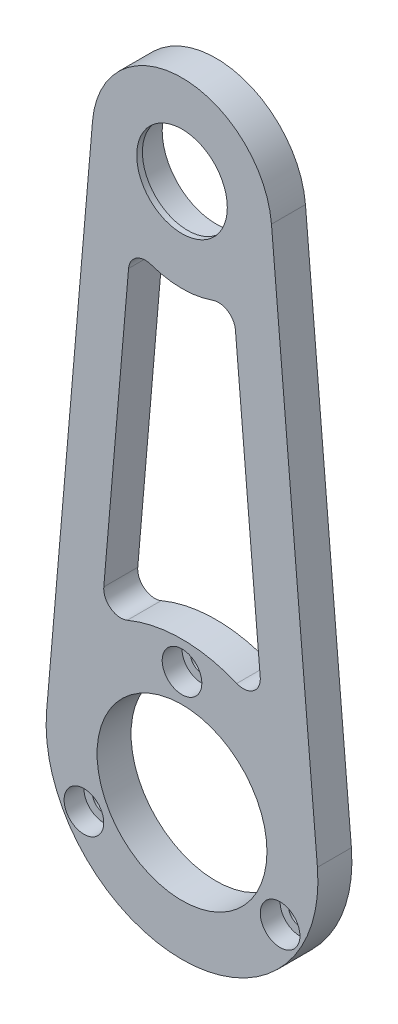
ISO-10303-21;
HEADER;
FILE_DESCRIPTION(('STEP AP214'),'2;1');
FILE_NAME('part.step','',(''),(''),'','','');
FILE_SCHEMA(('AUTOMOTIVE_DESIGN { 1 0 10303 214 1 1 1 1 }'));
ENDSEC;
DATA;
#1=APPLICATION_CONTEXT('core data for automotive mechanical design processes');
#2=APPLICATION_PROTOCOL_DEFINITION('international standard','automotive_design',2000,#1);
#3=PRODUCT_CONTEXT('',#1,'mechanical');
#4=PRODUCT('Part','Part','',(#3));
#5=PRODUCT_RELATED_PRODUCT_CATEGORY('part','',(#4));
#6=PRODUCT_DEFINITION_FORMATION('','',#4);
#7=PRODUCT_DEFINITION_CONTEXT('part definition',#1,'design');
#8=PRODUCT_DEFINITION('design','',#6,#7);
#9=PRODUCT_DEFINITION_SHAPE('','',#8);
#10=(LENGTH_UNIT() NAMED_UNIT(*) SI_UNIT(.MILLI.,.METRE.));
#11=(NAMED_UNIT(*) PLANE_ANGLE_UNIT() SI_UNIT($,.RADIAN.));
#12=(NAMED_UNIT(*) SI_UNIT($,.STERADIAN.) SOLID_ANGLE_UNIT());
#13=UNCERTAINTY_MEASURE_WITH_UNIT(LENGTH_MEASURE(1.E-05),#10,'distance_accuracy_value','');
#14=(GEOMETRIC_REPRESENTATION_CONTEXT(3) GLOBAL_UNCERTAINTY_ASSIGNED_CONTEXT((#13)) GLOBAL_UNIT_ASSIGNED_CONTEXT((#10,
#11,#12)) REPRESENTATION_CONTEXT('',''));
#15=CARTESIAN_POINT('',(0.,0.,0.));
#16=DIRECTION('',(0.,0.,1.));
#17=DIRECTION('',(1.,0.,0.));
#18=AXIS2_PLACEMENT_3D('',#15,#16,#17);
#19=CARTESIAN_POINT('',(0.,95.,6.));
#20=DIRECTION('',(0.,0.,-1.));
#21=DIRECTION('',(-1.,0.,0.));
#22=AXIS2_PLACEMENT_3D('',#19,#20,#21);
#23=CYLINDRICAL_SURFACE('',#22,9.5);
#24=CARTESIAN_POINT('',(0.,95.,0.));
#25=DIRECTION('',(0.,0.,-1.));
#26=DIRECTION('',(-1.,0.,0.));
#27=AXIS2_PLACEMENT_3D('',#24,#25,#26);
#28=CIRCLE('',#27,9.5);
#29=CARTESIAN_POINT('',(-9.5,95.,0.));
#30=VERTEX_POINT('',#29);
#31=EDGE_CURVE('E201',#30,#30,#28,.T.);
#32=ORIENTED_EDGE('',*,*,#31,.T.);
#33=EDGE_LOOP('',(#32));
#34=FACE_BOUND('',#33,.T.);
#35=CARTESIAN_POINT('',(0.,95.,5.));
#36=DIRECTION('',(0.,0.,1.));
#37=DIRECTION('',(1.,0.,0.));
#38=AXIS2_PLACEMENT_3D('',#35,#36,#37);
#39=CIRCLE('',#38,9.5);
#40=CARTESIAN_POINT('',(9.5,95.,5.));
#41=VERTEX_POINT('',#40);
#42=EDGE_CURVE('E11',#41,#41,#39,.F.);
#43=ORIENTED_EDGE('',*,*,#42,.F.);
#44=EDGE_LOOP('',(#43));
#45=FACE_BOUND('',#44,.T.);
#46=ADVANCED_FACE('F39',(#34,#45),#23,.F.);
#47=CARTESIAN_POINT('',(0.,20.,6.));
#48=DIRECTION('',(0.,0.,-1.));
#49=DIRECTION('',(-1.,0.,0.));
#50=AXIS2_PLACEMENT_3D('',#47,#48,#49);
#51=CYLINDRICAL_SURFACE('',#50,2.);
#52=CARTESIAN_POINT('',(0.,20.,0.));
#53=DIRECTION('',(0.,0.,1.));
#54=DIRECTION('',(1.,0.,0.));
#55=AXIS2_PLACEMENT_3D('',#52,#53,#54);
#56=CIRCLE('',#55,2.);
#57=CARTESIAN_POINT('',(2.,20.,0.));
#58=VERTEX_POINT('',#57);
#59=EDGE_CURVE('E241',#58,#58,#56,.T.);
#60=ORIENTED_EDGE('',*,*,#59,.F.);
#61=EDGE_LOOP('',(#60));
#62=FACE_BOUND('',#61,.T.);
#63=CARTESIAN_POINT('',(0.,20.,2.5));
#64=DIRECTION('',(0.,0.,1.));
#65=DIRECTION('',(1.,0.,0.));
#66=AXIS2_PLACEMENT_3D('',#63,#64,#65);
#67=CIRCLE('',#66,2.);
#68=CARTESIAN_POINT('',(2.,20.,2.5));
#69=VERTEX_POINT('',#68);
#70=EDGE_CURVE('E199',#69,#69,#67,.T.);
#71=ORIENTED_EDGE('',*,*,#70,.T.);
#72=EDGE_LOOP('',(#71));
#73=FACE_BOUND('',#72,.T.);
#74=ADVANCED_FACE('F280',(#62,#73),#51,.F.);
#75=CARTESIAN_POINT('',(17.3205080756888,-9.99999999999999,6.));
#76=DIRECTION('',(0.,0.,-1.));
#77=DIRECTION('',(-1.,0.,0.));
#78=AXIS2_PLACEMENT_3D('',#75,#76,#77);
#79=CYLINDRICAL_SURFACE('',#78,2.);
#80=CARTESIAN_POINT('',(17.3205080756888,-9.99999999999999,0.));
#81=DIRECTION('',(0.,0.,1.));
#82=DIRECTION('',(1.,0.,0.));
#83=AXIS2_PLACEMENT_3D('',#80,#81,#82);
#84=CIRCLE('',#83,2.);
#85=CARTESIAN_POINT('',(19.3205080756888,-9.99999999999999,0.));
#86=VERTEX_POINT('',#85);
#87=EDGE_CURVE('E238',#86,#86,#84,.T.);
#88=ORIENTED_EDGE('',*,*,#87,.F.);
#89=EDGE_LOOP('',(#88));
#90=FACE_BOUND('',#89,.T.);
#91=CARTESIAN_POINT('',(17.3205080756888,-9.99999999999999,2.5));
#92=DIRECTION('',(0.,0.,1.));
#93=DIRECTION('',(1.,0.,0.));
#94=AXIS2_PLACEMENT_3D('',#91,#92,#93);
#95=CIRCLE('',#94,2.);
#96=CARTESIAN_POINT('',(19.3205080756888,-9.99999999999999,2.5));
#97=VERTEX_POINT('',#96);
#98=EDGE_CURVE('E196',#97,#97,#95,.T.);
#99=ORIENTED_EDGE('',*,*,#98,.T.);
#100=EDGE_LOOP('',(#99));
#101=FACE_BOUND('',#100,.T.);
#102=ADVANCED_FACE('F287',(#90,#101),#79,.F.);
#103=CARTESIAN_POINT('',(-17.3205080756888,-10.,6.));
#104=DIRECTION('',(0.,0.,-1.));
#105=DIRECTION('',(-1.,0.,0.));
#106=AXIS2_PLACEMENT_3D('',#103,#104,#105);
#107=CYLINDRICAL_SURFACE('',#106,2.);
#108=CARTESIAN_POINT('',(-17.3205080756888,-10.,0.));
#109=DIRECTION('',(0.,0.,1.));
#110=DIRECTION('',(1.,0.,0.));
#111=AXIS2_PLACEMENT_3D('',#108,#109,#110);
#112=CIRCLE('',#111,2.);
#113=CARTESIAN_POINT('',(-15.3205080756888,-10.,0.));
#114=VERTEX_POINT('',#113);
#115=EDGE_CURVE('E227',#114,#114,#112,.T.);
#116=ORIENTED_EDGE('',*,*,#115,.F.);
#117=EDGE_LOOP('',(#116));
#118=FACE_BOUND('',#117,.T.);
#119=CARTESIAN_POINT('',(-17.3205080756888,-10.,2.5));
#120=DIRECTION('',(0.,0.,1.));
#121=DIRECTION('',(1.,0.,0.));
#122=AXIS2_PLACEMENT_3D('',#119,#120,#121);
#123=CIRCLE('',#122,2.);
#124=CARTESIAN_POINT('',(-15.3205080756888,-10.,2.5));
#125=VERTEX_POINT('',#124);
#126=EDGE_CURVE('E193',#125,#125,#123,.T.);
#127=ORIENTED_EDGE('',*,*,#126,.T.);
#128=EDGE_LOOP('',(#127));
#129=FACE_BOUND('',#128,.T.);
#130=ADVANCED_FACE('F311',(#118,#129),#107,.F.);
#131=CARTESIAN_POINT('',(0.,0.,6.));
#132=DIRECTION('',(0.,0.,1.));
#133=DIRECTION('',(1.,0.,0.));
#134=AXIS2_PLACEMENT_3D('',#131,#132,#133);
#135=PLANE('',#134);
#136=CARTESIAN_POINT('',(0.,20.,6.));
#137=DIRECTION('',(0.,0.,1.));
#138=DIRECTION('',(1.,0.,0.));
#139=AXIS2_PLACEMENT_3D('',#136,#137,#138);
#140=CIRCLE('',#139,3.5);
#141=CARTESIAN_POINT('',(3.5,20.,6.));
#142=VERTEX_POINT('',#141);
#143=EDGE_CURVE('E352',#142,#142,#140,.T.);
#144=ORIENTED_EDGE('',*,*,#143,.F.);
#145=EDGE_LOOP('',(#144));
#146=FACE_BOUND('',#145,.T.);
#147=CARTESIAN_POINT('',(17.3205080756896,-9.99999999999951,6.));
#148=DIRECTION('',(0.,0.,1.));
#149=DIRECTION('',(1.,0.,0.));
#150=AXIS2_PLACEMENT_3D('',#147,#148,#149);
#151=CIRCLE('',#150,3.50000000000076);
#152=CARTESIAN_POINT('',(20.8205080756904,-9.99999999999951,6.));
#153=VERTEX_POINT('',#152);
#154=EDGE_CURVE('E353',#153,#153,#151,.T.);
#155=ORIENTED_EDGE('',*,*,#154,.F.);
#156=EDGE_LOOP('',(#155));
#157=FACE_BOUND('',#156,.T.);
#158=CARTESIAN_POINT('',(-17.3205080756879,-10.0000000000005,6.));
#159=DIRECTION('',(0.,0.,1.));
#160=DIRECTION('',(1.,0.,0.));
#161=AXIS2_PLACEMENT_3D('',#158,#159,#160);
#162=CIRCLE('',#161,3.50000000000113);
#163=CARTESIAN_POINT('',(-13.8205080756868,-10.0000000000005,6.));
#164=VERTEX_POINT('',#163);
#165=EDGE_CURVE('E214',#164,#164,#162,.T.);
#166=ORIENTED_EDGE('',*,*,#165,.F.);
#167=EDGE_LOOP('',(#166));
#168=FACE_BOUND('',#167,.T.);
#169=CARTESIAN_POINT('',(0.,0.,6.));
#170=DIRECTION('',(0.,0.,1.));
#171=DIRECTION('',(1.,0.,0.));
#172=AXIS2_PLACEMENT_3D('',#169,#170,#171);
#173=CIRCLE('',#172,15.);
#174=CARTESIAN_POINT('',(15.,0.,6.));
#175=VERTEX_POINT('',#174);
#176=EDGE_CURVE('E245',#175,#175,#173,.T.);
#177=ORIENTED_EDGE('',*,*,#176,.F.);
#178=EDGE_LOOP('',(#177));
#179=FACE_BOUND('',#178,.T.);
#180=CARTESIAN_POINT('',(0.,0.,6.));
#181=DIRECTION('',(0.,0.,1.));
#182=DIRECTION('',(1.,0.,0.));
#183=AXIS2_PLACEMENT_3D('',#180,#181,#182);
#184=CIRCLE('',#183,24.);
#185=CARTESIAN_POINT('',(-23.911674204566,2.05714285714286,6.));
#186=VERTEX_POINT('',#185);
#187=CARTESIAN_POINT('',(23.911674204566,2.05714285714286,6.));
#188=VERTEX_POINT('',#187);
#189=EDGE_CURVE('E140',#186,#188,#184,.T.);
#190=ORIENTED_EDGE('',*,*,#189,.T.);
#191=DIRECTION('',(-0.085714285714286,0.996319758523582,0.));
#192=VECTOR('',#191,1.);
#193=CARTESIAN_POINT('',(23.911674204566,2.05714285714286,6.));
#194=LINE('',#193,#192);
#195=CARTESIAN_POINT('',(15.7987847423025,96.3591836734694,6.));
#196=VERTEX_POINT('',#195);
#197=EDGE_CURVE('E129',#188,#196,#194,.T.);
#198=ORIENTED_EDGE('',*,*,#197,.T.);
#199=CARTESIAN_POINT('',(0.,95.,6.));
#200=DIRECTION('',(0.,0.,1.));
#201=DIRECTION('',(1.,0.,0.));
#202=AXIS2_PLACEMENT_3D('',#199,#200,#201);
#203=CIRCLE('',#202,15.8571428571428);
#204=CARTESIAN_POINT('',(-15.7987847423025,96.3591836734694,6.));
#205=VERTEX_POINT('',#204);
#206=EDGE_CURVE('E139',#196,#205,#203,.T.);
#207=ORIENTED_EDGE('',*,*,#206,.T.);
#208=DIRECTION('',(-0.085714285714286,-0.996319758523582,0.));
#209=VECTOR('',#208,1.);
#210=CARTESIAN_POINT('',(-23.911674204566,2.05714285714286,6.));
#211=LINE('',#210,#209);
#212=EDGE_CURVE('E145',#205,#186,#211,.T.);
#213=ORIENTED_EDGE('',*,*,#212,.T.);
#214=EDGE_LOOP('',(#190,#198,#207,#213));
#215=FACE_BOUND('',#214,.T.);
#216=DIRECTION('',(-0.0857142857142861,0.996319758523582,0.));
#217=VECTOR('',#216,1.);
#218=CARTESIAN_POINT('',(14.2945984753232,20.5101061535354,6.));
#219=LINE('',#218,#217);
#220=CARTESIAN_POINT('',(13.8154709762109,26.0793550860728,6.));
#221=VERTEX_POINT('',#220);
#222=CARTESIAN_POINT('',(9.43751469155185,76.9675391502533,6.));
#223=VERTEX_POINT('',#222);
#224=EDGE_CURVE('E219',#221,#223,#219,.T.);
#225=ORIENTED_EDGE('',*,*,#224,.F.);
#226=CARTESIAN_POINT('',(10.8265117006402,25.82221222893,6.));
#227=DIRECTION('',(0.,0.,1.));
#228=DIRECTION('',(1.,0.,0.));
#229=AXIS2_PLACEMENT_3D('',#226,#227,#228);
#230=CIRCLE('',#229,3.);
#231=CARTESIAN_POINT('',(9.66652830414302,23.0555466329732,6.));
#232=VERTEX_POINT('',#231);
#233=EDGE_CURVE('E180',#221,#232,#230,.F.);
#234=ORIENTED_EDGE('',*,*,#233,.T.);
#235=CARTESIAN_POINT('',(0.,0.,6.));
#236=DIRECTION('',(0.,0.,-1.));
#237=DIRECTION('',(1.,0.,0.));
#238=AXIS2_PLACEMENT_3D('',#235,#236,#237);
#239=CIRCLE('',#238,25.);
#240=CARTESIAN_POINT('',(-9.66652830414302,23.0555466329732,6.));
#241=VERTEX_POINT('',#240);
#242=EDGE_CURVE('E216',#241,#232,#239,.T.);
#243=ORIENTED_EDGE('',*,*,#242,.F.);
#244=CARTESIAN_POINT('',(-10.8265117006402,25.82221222893,6.));
#245=DIRECTION('',(0.,0.,1.));
#246=DIRECTION('',(1.,0.,0.));
#247=AXIS2_PLACEMENT_3D('',#244,#245,#246);
#248=CIRCLE('',#247,3.);
#249=CARTESIAN_POINT('',(-13.8154709762109,26.0793550860728,6.));
#250=VERTEX_POINT('',#249);
#251=EDGE_CURVE('E184',#241,#250,#248,.F.);
#252=ORIENTED_EDGE('',*,*,#251,.T.);
#253=DIRECTION('',(-0.085714285714286,-0.996319758523583,0.));
#254=VECTOR('',#253,1.);
#255=CARTESIAN_POINT('',(-14.2945984753232,20.5101061535354,6.));
#256=LINE('',#255,#254);
#257=CARTESIAN_POINT('',(-9.43751469155185,76.9675391502533,6.));
#258=VERTEX_POINT('',#257);
#259=EDGE_CURVE('E225',#258,#250,#256,.T.);
#260=ORIENTED_EDGE('',*,*,#259,.F.);
#261=CARTESIAN_POINT('',(-6.4485554159811,76.7103962931104,6.));
#262=DIRECTION('',(0.,0.,1.));
#263=DIRECTION('',(1.,0.,0.));
#264=AXIS2_PLACEMENT_3D('',#261,#262,#263);
#265=CIRCLE('',#264,3.);
#266=CARTESIAN_POINT('',(-5.45100284066703,79.539687522285,6.));
#267=VERTEX_POINT('',#266);
#268=EDGE_CURVE('E47',#258,#267,#265,.F.);
#269=ORIENTED_EDGE('',*,*,#268,.T.);
#270=CARTESIAN_POINT('',(0.,95.,6.));
#271=DIRECTION('',(0.,0.,-1.));
#272=DIRECTION('',(1.,0.,0.));
#273=AXIS2_PLACEMENT_3D('',#270,#271,#272);
#274=CIRCLE('',#273,16.3931294717497);
#275=CARTESIAN_POINT('',(5.45100284066703,79.539687522285,6.));
#276=VERTEX_POINT('',#275);
#277=EDGE_CURVE('E223',#276,#267,#274,.T.);
#278=ORIENTED_EDGE('',*,*,#277,.F.);
#279=CARTESIAN_POINT('',(6.4485554159811,76.7103962931104,6.));
#280=DIRECTION('',(0.,0.,1.));
#281=DIRECTION('',(1.,0.,0.));
#282=AXIS2_PLACEMENT_3D('',#279,#280,#281);
#283=CIRCLE('',#282,3.);
#284=EDGE_CURVE('E188',#276,#223,#283,.F.);
#285=ORIENTED_EDGE('',*,*,#284,.T.);
#286=EDGE_LOOP('',(#225,#234,#243,#252,#260,#269,#278,#285));
#287=FACE_BOUND('',#286,.T.);
#288=CARTESIAN_POINT('',(0.,95.,6.));
#289=DIRECTION('',(0.,0.,1.));
#290=DIRECTION('',(1.,0.,0.));
#291=AXIS2_PLACEMENT_3D('',#288,#289,#290);
#292=CIRCLE('',#291,8.);
#293=CARTESIAN_POINT('',(8.,95.,6.));
#294=VERTEX_POINT('',#293);
#295=EDGE_CURVE('E369',#294,#294,#292,.T.);
#296=ORIENTED_EDGE('',*,*,#295,.F.);
#297=EDGE_LOOP('',(#296));
#298=FACE_BOUND('',#297,.T.);
#299=ADVANCED_FACE('F143',(#146,#157,#168,#179,#215,#287,#298),#135,.T.);
#300=CARTESIAN_POINT('',(0.,0.,0.));
#301=DIRECTION('',(0.,0.,1.));
#302=DIRECTION('',(1.,0.,0.));
#303=AXIS2_PLACEMENT_3D('',#300,#301,#302);
#304=PLANE('',#303);
#305=ORIENTED_EDGE('',*,*,#31,.F.);
#306=EDGE_LOOP('',(#305));
#307=FACE_BOUND('',#306,.T.);
#308=ORIENTED_EDGE('',*,*,#115,.T.);
#309=EDGE_LOOP('',(#308));
#310=FACE_BOUND('',#309,.T.);
#311=ORIENTED_EDGE('',*,*,#87,.T.);
#312=EDGE_LOOP('',(#311));
#313=FACE_BOUND('',#312,.T.);
#314=ORIENTED_EDGE('',*,*,#59,.T.);
#315=EDGE_LOOP('',(#314));
#316=FACE_BOUND('',#315,.T.);
#317=CARTESIAN_POINT('',(0.,0.,0.));
#318=DIRECTION('',(0.,0.,1.));
#319=DIRECTION('',(1.,0.,0.));
#320=AXIS2_PLACEMENT_3D('',#317,#318,#319);
#321=CIRCLE('',#320,15.);
#322=CARTESIAN_POINT('',(15.,0.,0.));
#323=VERTEX_POINT('',#322);
#324=EDGE_CURVE('E244',#323,#323,#321,.T.);
#325=ORIENTED_EDGE('',*,*,#324,.T.);
#326=EDGE_LOOP('',(#325));
#327=FACE_BOUND('',#326,.T.);
#328=CARTESIAN_POINT('',(0.,0.,0.));
#329=DIRECTION('',(0.,0.,1.));
#330=DIRECTION('',(1.,0.,0.));
#331=AXIS2_PLACEMENT_3D('',#328,#329,#330);
#332=CIRCLE('',#331,24.);
#333=CARTESIAN_POINT('',(-23.911674204566,2.05714285714286,0.));
#334=VERTEX_POINT('',#333);
#335=CARTESIAN_POINT('',(23.911674204566,2.05714285714286,0.));
#336=VERTEX_POINT('',#335);
#337=EDGE_CURVE('E153',#334,#336,#332,.T.);
#338=ORIENTED_EDGE('',*,*,#337,.F.);
#339=DIRECTION('',(-0.085714285714286,-0.996319758523582,0.));
#340=VECTOR('',#339,1.);
#341=CARTESIAN_POINT('',(-23.911674204566,2.05714285714286,0.));
#342=LINE('',#341,#340);
#343=CARTESIAN_POINT('',(-15.7987847423025,96.3591836734694,0.));
#344=VERTEX_POINT('',#343);
#345=EDGE_CURVE('E149',#344,#334,#342,.T.);
#346=ORIENTED_EDGE('',*,*,#345,.F.);
#347=CARTESIAN_POINT('',(0.,95.,0.));
#348=DIRECTION('',(0.,0.,1.));
#349=DIRECTION('',(1.,0.,0.));
#350=AXIS2_PLACEMENT_3D('',#347,#348,#349);
#351=CIRCLE('',#350,15.8571428571428);
#352=CARTESIAN_POINT('',(15.7987847423025,96.3591836734694,0.));
#353=VERTEX_POINT('',#352);
#354=EDGE_CURVE('E256',#353,#344,#351,.T.);
#355=ORIENTED_EDGE('',*,*,#354,.F.);
#356=DIRECTION('',(-0.085714285714286,0.996319758523582,0.));
#357=VECTOR('',#356,1.);
#358=CARTESIAN_POINT('',(23.911674204566,2.05714285714286,0.));
#359=LINE('',#358,#357);
#360=EDGE_CURVE('E254',#336,#353,#359,.T.);
#361=ORIENTED_EDGE('',*,*,#360,.F.);
#362=EDGE_LOOP('',(#338,#346,#355,#361));
#363=FACE_BOUND('',#362,.T.);
#364=DIRECTION('',(-0.085714285714286,-0.996319758523583,0.));
#365=VECTOR('',#364,1.);
#366=CARTESIAN_POINT('',(-14.2945984753232,20.5101061535354,0.));
#367=LINE('',#366,#365);
#368=CARTESIAN_POINT('',(-9.43751469155185,76.9675391502533,0.));
#369=VERTEX_POINT('',#368);
#370=CARTESIAN_POINT('',(-13.8154709762109,26.0793550860728,0.));
#371=VERTEX_POINT('',#370);
#372=EDGE_CURVE('E220',#369,#371,#367,.T.);
#373=ORIENTED_EDGE('',*,*,#372,.T.);
#374=CARTESIAN_POINT('',(-10.8265117006402,25.82221222893,0.));
#375=DIRECTION('',(0.,0.,1.));
#376=DIRECTION('',(1.,0.,0.));
#377=AXIS2_PLACEMENT_3D('',#374,#375,#376);
#378=CIRCLE('',#377,3.);
#379=CARTESIAN_POINT('',(-9.66652830414302,23.0555466329732,0.));
#380=VERTEX_POINT('',#379);
#381=EDGE_CURVE('E182',#371,#380,#378,.T.);
#382=ORIENTED_EDGE('',*,*,#381,.T.);
#383=CARTESIAN_POINT('',(0.,0.,0.));
#384=DIRECTION('',(0.,0.,-1.));
#385=DIRECTION('',(1.,0.,0.));
#386=AXIS2_PLACEMENT_3D('',#383,#384,#385);
#387=CIRCLE('',#386,25.);
#388=CARTESIAN_POINT('',(9.66652830414302,23.0555466329732,0.));
#389=VERTEX_POINT('',#388);
#390=EDGE_CURVE('E205',#380,#389,#387,.T.);
#391=ORIENTED_EDGE('',*,*,#390,.T.);
#392=CARTESIAN_POINT('',(10.8265117006402,25.82221222893,0.));
#393=DIRECTION('',(0.,0.,1.));
#394=DIRECTION('',(1.,0.,0.));
#395=AXIS2_PLACEMENT_3D('',#392,#393,#394);
#396=CIRCLE('',#395,3.);
#397=CARTESIAN_POINT('',(13.8154709762109,26.0793550860728,0.));
#398=VERTEX_POINT('',#397);
#399=EDGE_CURVE('E178',#389,#398,#396,.T.);
#400=ORIENTED_EDGE('',*,*,#399,.T.);
#401=DIRECTION('',(-0.0857142857142861,0.996319758523582,0.));
#402=VECTOR('',#401,1.);
#403=CARTESIAN_POINT('',(14.2945984753232,20.5101061535354,0.));
#404=LINE('',#403,#402);
#405=CARTESIAN_POINT('',(9.43751469155185,76.9675391502533,0.));
#406=VERTEX_POINT('',#405);
#407=EDGE_CURVE('E210',#398,#406,#404,.T.);
#408=ORIENTED_EDGE('',*,*,#407,.T.);
#409=CARTESIAN_POINT('',(6.4485554159811,76.7103962931104,0.));
#410=DIRECTION('',(0.,0.,1.));
#411=DIRECTION('',(1.,0.,0.));
#412=AXIS2_PLACEMENT_3D('',#409,#410,#411);
#413=CIRCLE('',#412,3.);
#414=CARTESIAN_POINT('',(5.45100284066703,79.539687522285,0.));
#415=VERTEX_POINT('',#414);
#416=EDGE_CURVE('E186',#406,#415,#413,.T.);
#417=ORIENTED_EDGE('',*,*,#416,.T.);
#418=CARTESIAN_POINT('',(0.,95.,0.));
#419=DIRECTION('',(0.,0.,-1.));
#420=DIRECTION('',(1.,0.,0.));
#421=AXIS2_PLACEMENT_3D('',#418,#419,#420);
#422=CIRCLE('',#421,16.3931294717497);
#423=CARTESIAN_POINT('',(-5.45100284066703,79.539687522285,0.));
#424=VERTEX_POINT('',#423);
#425=EDGE_CURVE('E231',#415,#424,#422,.T.);
#426=ORIENTED_EDGE('',*,*,#425,.T.);
#427=CARTESIAN_POINT('',(-6.4485554159811,76.7103962931104,0.));
#428=DIRECTION('',(0.,0.,1.));
#429=DIRECTION('',(1.,0.,0.));
#430=AXIS2_PLACEMENT_3D('',#427,#428,#429);
#431=CIRCLE('',#430,3.);
#432=EDGE_CURVE('E190',#424,#369,#431,.T.);
#433=ORIENTED_EDGE('',*,*,#432,.T.);
#434=EDGE_LOOP('',(#373,#382,#391,#400,#408,#417,#426,#433));
#435=FACE_BOUND('',#434,.T.);
#436=ADVANCED_FACE('F267',(#307,#310,#313,#316,#327,#363,#435),#304,.F.);
#437=CARTESIAN_POINT('',(0.,0.,6.));
#438=DIRECTION('',(0.,0.,-1.));
#439=DIRECTION('',(-1.,0.,0.));
#440=AXIS2_PLACEMENT_3D('',#437,#438,#439);
#441=CYLINDRICAL_SURFACE('',#440,24.);
#442=ORIENTED_EDGE('',*,*,#337,.T.);
#443=DIRECTION('',(0.,0.,-1.));
#444=VECTOR('',#443,1.);
#445=CARTESIAN_POINT('',(23.911674204566,2.05714285714286,6.));
#446=LINE('',#445,#444);
#447=EDGE_CURVE('E133',#188,#336,#446,.T.);
#448=ORIENTED_EDGE('',*,*,#447,.F.);
#449=ORIENTED_EDGE('',*,*,#189,.F.);
#450=DIRECTION('',(0.,0.,-1.));
#451=VECTOR('',#450,1.);
#452=CARTESIAN_POINT('',(-23.911674204566,2.05714285714286,6.));
#453=LINE('',#452,#451);
#454=EDGE_CURVE('E252',#186,#334,#453,.T.);
#455=ORIENTED_EDGE('',*,*,#454,.T.);
#456=EDGE_LOOP('',(#442,#448,#449,#455));
#457=FACE_BOUND('',#456,.T.);
#458=ADVANCED_FACE('F151',(#457),#441,.T.);
#459=CARTESIAN_POINT('',(23.911674204566,2.05714285714286,6.));
#460=DIRECTION('',(-0.996319758523582,-0.085714285714286,0.));
#461=DIRECTION('',(0.085714285714286,-0.996319758523582,0.));
#462=AXIS2_PLACEMENT_3D('',#459,#460,#461);
#463=PLANE('',#462);
#464=ORIENTED_EDGE('',*,*,#360,.T.);
#465=DIRECTION('',(0.,0.,-1.));
#466=VECTOR('',#465,1.);
#467=CARTESIAN_POINT('',(15.7987847423025,96.3591836734694,6.));
#468=LINE('',#467,#466);
#469=EDGE_CURVE('E136',#196,#353,#468,.T.);
#470=ORIENTED_EDGE('',*,*,#469,.F.);
#471=ORIENTED_EDGE('',*,*,#197,.F.);
#472=ORIENTED_EDGE('',*,*,#447,.T.);
#473=EDGE_LOOP('',(#464,#470,#471,#472));
#474=FACE_BOUND('',#473,.T.);
#475=ADVANCED_FACE('F131',(#474),#463,.F.);
#476=CARTESIAN_POINT('',(0.,95.,6.));
#477=DIRECTION('',(0.,0.,-1.));
#478=DIRECTION('',(-1.,0.,0.));
#479=AXIS2_PLACEMENT_3D('',#476,#477,#478);
#480=CYLINDRICAL_SURFACE('',#479,15.8571428571428);
#481=ORIENTED_EDGE('',*,*,#354,.T.);
#482=DIRECTION('',(0.,0.,-1.));
#483=VECTOR('',#482,1.);
#484=CARTESIAN_POINT('',(-15.7987847423025,96.3591836734694,6.));
#485=LINE('',#484,#483);
#486=EDGE_CURVE('E158',#205,#344,#485,.T.);
#487=ORIENTED_EDGE('',*,*,#486,.F.);
#488=ORIENTED_EDGE('',*,*,#206,.F.);
#489=ORIENTED_EDGE('',*,*,#469,.T.);
#490=EDGE_LOOP('',(#481,#487,#488,#489));
#491=FACE_BOUND('',#490,.T.);
#492=ADVANCED_FACE('F269',(#491),#480,.T.);
#493=CARTESIAN_POINT('',(-23.911674204566,2.05714285714286,6.));
#494=DIRECTION('',(0.996319758523582,-0.085714285714286,0.));
#495=DIRECTION('',(0.085714285714286,0.996319758523582,0.));
#496=AXIS2_PLACEMENT_3D('',#493,#494,#495);
#497=PLANE('',#496);
#498=ORIENTED_EDGE('',*,*,#345,.T.);
#499=ORIENTED_EDGE('',*,*,#454,.F.);
#500=ORIENTED_EDGE('',*,*,#212,.F.);
#501=ORIENTED_EDGE('',*,*,#486,.T.);
#502=EDGE_LOOP('',(#498,#499,#500,#501));
#503=FACE_BOUND('',#502,.T.);
#504=ADVANCED_FACE('F263',(#503),#497,.F.);
#505=CARTESIAN_POINT('',(0.,0.,6.));
#506=DIRECTION('',(0.,0.,-1.));
#507=DIRECTION('',(-1.,0.,0.));
#508=AXIS2_PLACEMENT_3D('',#505,#506,#507);
#509=CYLINDRICAL_SURFACE('',#508,15.);
#510=ORIENTED_EDGE('',*,*,#176,.T.);
#511=EDGE_LOOP('',(#510));
#512=FACE_BOUND('',#511,.T.);
#513=ORIENTED_EDGE('',*,*,#324,.F.);
#514=EDGE_LOOP('',(#513));
#515=FACE_BOUND('',#514,.T.);
#516=ADVANCED_FACE('F276',(#512,#515),#509,.F.);
#517=CARTESIAN_POINT('',(0.,0.,6.));
#518=DIRECTION('',(0.,0.,-1.));
#519=DIRECTION('',(-1.,0.,0.));
#520=AXIS2_PLACEMENT_3D('',#517,#518,#519);
#521=CYLINDRICAL_SURFACE('',#520,25.);
#522=ORIENTED_EDGE('',*,*,#242,.T.);
#523=DIRECTION('',(0.,0.,-1.));
#524=VECTOR('',#523,1.);
#525=CARTESIAN_POINT('',(9.66652830414303,23.0555466329732,6.));
#526=LINE('',#525,#524);
#527=EDGE_CURVE('E156',#232,#389,#526,.T.);
#528=ORIENTED_EDGE('',*,*,#527,.T.);
#529=ORIENTED_EDGE('',*,*,#390,.F.);
#530=DIRECTION('',(0.,0.,-1.));
#531=VECTOR('',#530,1.);
#532=CARTESIAN_POINT('',(-9.66652830414302,23.0555466329732,6.));
#533=LINE('',#532,#531);
#534=EDGE_CURVE('E154',#380,#241,#533,.F.);
#535=ORIENTED_EDGE('',*,*,#534,.T.);
#536=EDGE_LOOP('',(#522,#528,#529,#535));
#537=FACE_BOUND('',#536,.T.);
#538=ADVANCED_FACE('F306',(#537),#521,.T.);
#539=CARTESIAN_POINT('',(14.2945984753232,20.5101061535354,6.));
#540=DIRECTION('',(-0.996319758523582,-0.0857142857142861,0.));
#541=DIRECTION('',(0.0857142857142861,-0.996319758523582,0.));
#542=AXIS2_PLACEMENT_3D('',#539,#540,#541);
#543=PLANE('',#542);
#544=ORIENTED_EDGE('',*,*,#407,.F.);
#545=DIRECTION('',(0.,0.,1.));
#546=VECTOR('',#545,1.);
#547=CARTESIAN_POINT('',(13.8154709762109,26.0793550860728,6.));
#548=LINE('',#547,#546);
#549=EDGE_CURVE('E167',#398,#221,#548,.T.);
#550=ORIENTED_EDGE('',*,*,#549,.T.);
#551=ORIENTED_EDGE('',*,*,#224,.T.);
#552=DIRECTION('',(0.,0.,1.));
#553=VECTOR('',#552,1.);
#554=CARTESIAN_POINT('',(9.43751469155185,76.9675391502533,0.));
#555=LINE('',#554,#553);
#556=EDGE_CURVE('E164',#223,#406,#555,.F.);
#557=ORIENTED_EDGE('',*,*,#556,.T.);
#558=EDGE_LOOP('',(#544,#550,#551,#557));
#559=FACE_BOUND('',#558,.T.);
#560=ADVANCED_FACE('F303',(#559),#543,.T.);
#561=CARTESIAN_POINT('',(0.,95.,6.));
#562=DIRECTION('',(0.,0.,-1.));
#563=DIRECTION('',(-1.,0.,0.));
#564=AXIS2_PLACEMENT_3D('',#561,#562,#563);
#565=CYLINDRICAL_SURFACE('',#564,16.3931294717497);
#566=ORIENTED_EDGE('',*,*,#425,.F.);
#567=DIRECTION('',(0.,0.,-1.));
#568=VECTOR('',#567,1.);
#569=CARTESIAN_POINT('',(5.45100284066703,79.539687522285,6.));
#570=LINE('',#569,#568);
#571=EDGE_CURVE('E60',#415,#276,#570,.F.);
#572=ORIENTED_EDGE('',*,*,#571,.T.);
#573=ORIENTED_EDGE('',*,*,#277,.T.);
#574=DIRECTION('',(0.,0.,-1.));
#575=VECTOR('',#574,1.);
#576=CARTESIAN_POINT('',(-5.45100284066703,79.539687522285,6.));
#577=LINE('',#576,#575);
#578=EDGE_CURVE('E174',#267,#424,#577,.T.);
#579=ORIENTED_EDGE('',*,*,#578,.T.);
#580=EDGE_LOOP('',(#566,#572,#573,#579));
#581=FACE_BOUND('',#580,.T.);
#582=ADVANCED_FACE('F299',(#581),#565,.T.);
#583=CARTESIAN_POINT('',(-14.2945984753232,20.5101061535354,6.));
#584=DIRECTION('',(0.996319758523582,-0.085714285714286,0.));
#585=DIRECTION('',(0.085714285714286,0.996319758523582,0.));
#586=AXIS2_PLACEMENT_3D('',#583,#584,#585);
#587=PLANE('',#586);
#588=ORIENTED_EDGE('',*,*,#259,.T.);
#589=DIRECTION('',(0.,0.,1.));
#590=VECTOR('',#589,1.);
#591=CARTESIAN_POINT('',(-13.8154709762109,26.0793550860728,0.));
#592=LINE('',#591,#590);
#593=EDGE_CURVE('E171',#250,#371,#592,.F.);
#594=ORIENTED_EDGE('',*,*,#593,.T.);
#595=ORIENTED_EDGE('',*,*,#372,.F.);
#596=DIRECTION('',(0.,0.,1.));
#597=VECTOR('',#596,1.);
#598=CARTESIAN_POINT('',(-9.43751469155185,76.9675391502533,6.));
#599=LINE('',#598,#597);
#600=EDGE_CURVE('E169',#369,#258,#599,.T.);
#601=ORIENTED_EDGE('',*,*,#600,.T.);
#602=EDGE_LOOP('',(#588,#594,#595,#601));
#603=FACE_BOUND('',#602,.T.);
#604=ADVANCED_FACE('F295',(#603),#587,.T.);
#605=CARTESIAN_POINT('',(10.8265117006402,25.82221222893,6.));
#606=DIRECTION('',(0.,0.,-1.));
#607=DIRECTION('',(-1.,0.,0.));
#608=AXIS2_PLACEMENT_3D('',#605,#606,#607);
#609=CYLINDRICAL_SURFACE('',#608,3.);
#610=ORIENTED_EDGE('',*,*,#233,.F.);
#611=ORIENTED_EDGE('',*,*,#549,.F.);
#612=ORIENTED_EDGE('',*,*,#399,.F.);
#613=ORIENTED_EDGE('',*,*,#527,.F.);
#614=EDGE_LOOP('',(#610,#611,#612,#613));
#615=FACE_BOUND('',#614,.T.);
#616=ADVANCED_FACE('F298',(#615),#609,.F.);
#617=CARTESIAN_POINT('',(-10.8265117006402,25.82221222893,6.));
#618=DIRECTION('',(0.,0.,-1.));
#619=DIRECTION('',(-1.,0.,0.));
#620=AXIS2_PLACEMENT_3D('',#617,#618,#619);
#621=CYLINDRICAL_SURFACE('',#620,3.);
#622=ORIENTED_EDGE('',*,*,#251,.F.);
#623=ORIENTED_EDGE('',*,*,#534,.F.);
#624=ORIENTED_EDGE('',*,*,#381,.F.);
#625=ORIENTED_EDGE('',*,*,#593,.F.);
#626=EDGE_LOOP('',(#622,#623,#624,#625));
#627=FACE_BOUND('',#626,.T.);
#628=ADVANCED_FACE('F473',(#627),#621,.F.);
#629=CARTESIAN_POINT('',(6.4485554159811,76.7103962931104,6.));
#630=DIRECTION('',(0.,0.,-1.));
#631=DIRECTION('',(-1.,0.,0.));
#632=AXIS2_PLACEMENT_3D('',#629,#630,#631);
#633=CYLINDRICAL_SURFACE('',#632,3.);
#634=ORIENTED_EDGE('',*,*,#284,.F.);
#635=ORIENTED_EDGE('',*,*,#571,.F.);
#636=ORIENTED_EDGE('',*,*,#416,.F.);
#637=ORIENTED_EDGE('',*,*,#556,.F.);
#638=EDGE_LOOP('',(#634,#635,#636,#637));
#639=FACE_BOUND('',#638,.T.);
#640=ADVANCED_FACE('F466',(#639),#633,.F.);
#641=CARTESIAN_POINT('',(-6.4485554159811,76.7103962931104,6.));
#642=DIRECTION('',(0.,0.,-1.));
#643=DIRECTION('',(-1.,0.,0.));
#644=AXIS2_PLACEMENT_3D('',#641,#642,#643);
#645=CYLINDRICAL_SURFACE('',#644,3.);
#646=ORIENTED_EDGE('',*,*,#268,.F.);
#647=ORIENTED_EDGE('',*,*,#600,.F.);
#648=ORIENTED_EDGE('',*,*,#432,.F.);
#649=ORIENTED_EDGE('',*,*,#578,.F.);
#650=EDGE_LOOP('',(#646,#647,#648,#649));
#651=FACE_BOUND('',#650,.T.);
#652=ADVANCED_FACE('F41',(#651),#645,.F.);
#653=CARTESIAN_POINT('',(-17.3205080756879,-10.0000000000005,2.5));
#654=DIRECTION('',(0.,0.,1.));
#655=DIRECTION('',(1.,0.,0.));
#656=AXIS2_PLACEMENT_3D('',#653,#654,#655);
#657=CYLINDRICAL_SURFACE('',#656,3.50000000000113);
#658=CARTESIAN_POINT('',(-17.3205080756879,-10.0000000000005,2.5));
#659=DIRECTION('',(0.,0.,1.));
#660=DIRECTION('',(1.,0.,0.));
#661=AXIS2_PLACEMENT_3D('',#658,#659,#660);
#662=CIRCLE('',#661,3.50000000000113);
#663=CARTESIAN_POINT('',(-13.8205080756868,-10.0000000000005,2.5));
#664=VERTEX_POINT('',#663);
#665=EDGE_CURVE('E358',#664,#664,#662,.T.);
#666=ORIENTED_EDGE('',*,*,#665,.F.);
#667=EDGE_LOOP('',(#666));
#668=FACE_BOUND('',#667,.T.);
#669=ORIENTED_EDGE('',*,*,#165,.T.);
#670=EDGE_LOOP('',(#669));
#671=FACE_BOUND('',#670,.T.);
#672=ADVANCED_FACE('F293',(#668,#671),#657,.F.);
#673=CARTESIAN_POINT('',(-17.3205080756879,-10.0000000000005,2.5));
#674=DIRECTION('',(0.,0.,1.));
#675=DIRECTION('',(1.,0.,0.));
#676=AXIS2_PLACEMENT_3D('',#673,#674,#675);
#677=PLANE('',#676);
#678=ORIENTED_EDGE('',*,*,#126,.F.);
#679=EDGE_LOOP('',(#678));
#680=FACE_BOUND('',#679,.T.);
#681=ORIENTED_EDGE('',*,*,#665,.T.);
#682=EDGE_LOOP('',(#681));
#683=FACE_BOUND('',#682,.T.);
#684=ADVANCED_FACE('F391',(#680,#683),#677,.T.);
#685=CARTESIAN_POINT('',(17.3205080756896,-9.99999999999951,2.5));
#686=DIRECTION('',(0.,0.,1.));
#687=DIRECTION('',(1.,0.,0.));
#688=AXIS2_PLACEMENT_3D('',#685,#686,#687);
#689=CYLINDRICAL_SURFACE('',#688,3.50000000000076);
#690=CARTESIAN_POINT('',(17.3205080756896,-9.99999999999951,2.5));
#691=DIRECTION('',(0.,0.,1.));
#692=DIRECTION('',(1.,0.,0.));
#693=AXIS2_PLACEMENT_3D('',#690,#691,#692);
#694=CIRCLE('',#693,3.50000000000076);
#695=CARTESIAN_POINT('',(20.8205080756904,-9.99999999999951,2.5));
#696=VERTEX_POINT('',#695);
#697=EDGE_CURVE('E350',#696,#696,#694,.T.);
#698=ORIENTED_EDGE('',*,*,#697,.F.);
#699=EDGE_LOOP('',(#698));
#700=FACE_BOUND('',#699,.T.);
#701=ORIENTED_EDGE('',*,*,#154,.T.);
#702=EDGE_LOOP('',(#701));
#703=FACE_BOUND('',#702,.T.);
#704=ADVANCED_FACE('F346',(#700,#703),#689,.F.);
#705=CARTESIAN_POINT('',(17.3205080756896,-9.99999999999951,2.5));
#706=DIRECTION('',(0.,0.,1.));
#707=DIRECTION('',(1.,0.,0.));
#708=AXIS2_PLACEMENT_3D('',#705,#706,#707);
#709=PLANE('',#708);
#710=ORIENTED_EDGE('',*,*,#98,.F.);
#711=EDGE_LOOP('',(#710));
#712=FACE_BOUND('',#711,.T.);
#713=ORIENTED_EDGE('',*,*,#697,.T.);
#714=EDGE_LOOP('',(#713));
#715=FACE_BOUND('',#714,.T.);
#716=ADVANCED_FACE('F342',(#712,#715),#709,.T.);
#717=CARTESIAN_POINT('',(0.,20.,2.5));
#718=DIRECTION('',(0.,0.,1.));
#719=DIRECTION('',(1.,0.,0.));
#720=AXIS2_PLACEMENT_3D('',#717,#718,#719);
#721=CYLINDRICAL_SURFACE('',#720,3.5);
#722=CARTESIAN_POINT('',(0.,20.,2.5));
#723=DIRECTION('',(0.,0.,1.));
#724=DIRECTION('',(1.,0.,0.));
#725=AXIS2_PLACEMENT_3D('',#722,#723,#724);
#726=CIRCLE('',#725,3.5);
#727=CARTESIAN_POINT('',(3.5,20.,2.5));
#728=VERTEX_POINT('',#727);
#729=EDGE_CURVE('E197',#728,#728,#726,.T.);
#730=ORIENTED_EDGE('',*,*,#729,.F.);
#731=EDGE_LOOP('',(#730));
#732=FACE_BOUND('',#731,.T.);
#733=ORIENTED_EDGE('',*,*,#143,.T.);
#734=EDGE_LOOP('',(#733));
#735=FACE_BOUND('',#734,.T.);
#736=ADVANCED_FACE('F345',(#732,#735),#721,.F.);
#737=CARTESIAN_POINT('',(0.,20.,2.5));
#738=DIRECTION('',(0.,0.,1.));
#739=DIRECTION('',(1.,0.,0.));
#740=AXIS2_PLACEMENT_3D('',#737,#738,#739);
#741=PLANE('',#740);
#742=ORIENTED_EDGE('',*,*,#70,.F.);
#743=EDGE_LOOP('',(#742));
#744=FACE_BOUND('',#743,.T.);
#745=ORIENTED_EDGE('',*,*,#729,.T.);
#746=EDGE_LOOP('',(#745));
#747=FACE_BOUND('',#746,.T.);
#748=ADVANCED_FACE('F378',(#744,#747),#741,.T.);
#749=CARTESIAN_POINT('',(0.,95.,5.));
#750=DIRECTION('',(0.,0.,1.));
#751=DIRECTION('',(1.,0.,0.));
#752=AXIS2_PLACEMENT_3D('',#749,#750,#751);
#753=PLANE('',#752);
#754=CARTESIAN_POINT('',(0.,95.,5.));
#755=DIRECTION('',(0.,0.,1.));
#756=DIRECTION('',(1.,0.,0.));
#757=AXIS2_PLACEMENT_3D('',#754,#755,#756);
#758=CIRCLE('',#757,8.);
#759=CARTESIAN_POINT('',(8.,95.,5.));
#760=VERTEX_POINT('',#759);
#761=EDGE_CURVE('E365',#760,#760,#758,.T.);
#762=ORIENTED_EDGE('',*,*,#761,.T.);
#763=EDGE_LOOP('',(#762));
#764=FACE_BOUND('',#763,.T.);
#765=ORIENTED_EDGE('',*,*,#42,.T.);
#766=EDGE_LOOP('',(#765));
#767=FACE_BOUND('',#766,.T.);
#768=ADVANCED_FACE('F399',(#764,#767),#753,.F.);
#769=CARTESIAN_POINT('',(0.,95.,5.));
#770=DIRECTION('',(0.,0.,1.));
#771=DIRECTION('',(1.,0.,0.));
#772=AXIS2_PLACEMENT_3D('',#769,#770,#771);
#773=CYLINDRICAL_SURFACE('',#772,8.);
#774=ORIENTED_EDGE('',*,*,#761,.F.);
#775=EDGE_LOOP('',(#774));
#776=FACE_BOUND('',#775,.T.);
#777=ORIENTED_EDGE('',*,*,#295,.T.);
#778=EDGE_LOOP('',(#777));
#779=FACE_BOUND('',#778,.T.);
#780=ADVANCED_FACE('F403',(#776,#779),#773,.F.);
#781=CLOSED_SHELL('',(#46,#74,#102,#130,#299,#436,#458,#475,#492,#504,#516,#538,#560,#582,#604,
#616,#628,#640,#652,#672,#684,#704,#716,#736,#748,#768,#780));
#782=MANIFOLD_SOLID_BREP('B2',#781);
#783=ADVANCED_BREP_SHAPE_REPRESENTATION('',(#18,#782),#14);
#784=SHAPE_DEFINITION_REPRESENTATION(#9,#783);
ENDSEC;
END-ISO-10303-21;
